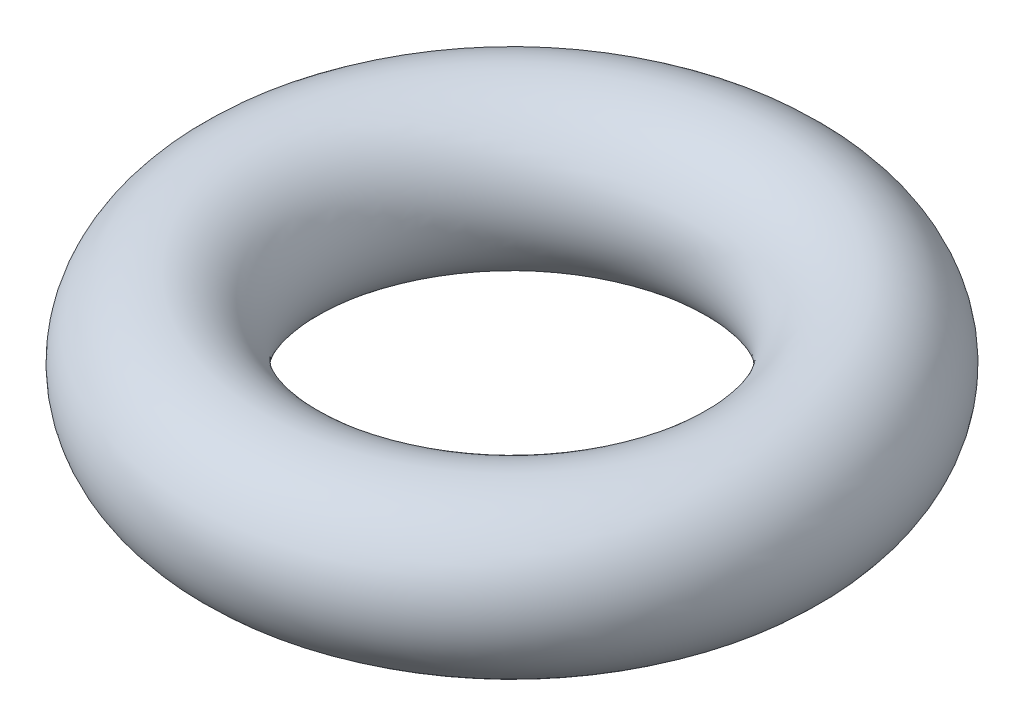
ISO-10303-21;
HEADER;
FILE_DESCRIPTION(('STEP AP214'),'2;1');
FILE_NAME('part.step','',(''),(''),'','','');
FILE_SCHEMA(('AUTOMOTIVE_DESIGN { 1 0 10303 214 1 1 1 1 }'));
ENDSEC;
DATA;
#1=APPLICATION_CONTEXT('core data for automotive mechanical design processes');
#2=APPLICATION_PROTOCOL_DEFINITION('international standard','automotive_design',2000,#1);
#3=PRODUCT_CONTEXT('',#1,'mechanical');
#4=PRODUCT('Part','Part','',(#3));
#5=PRODUCT_RELATED_PRODUCT_CATEGORY('part','',(#4));
#6=PRODUCT_DEFINITION_FORMATION('','',#4);
#7=PRODUCT_DEFINITION_CONTEXT('part definition',#1,'design');
#8=PRODUCT_DEFINITION('design','',#6,#7);
#9=PRODUCT_DEFINITION_SHAPE('','',#8);
#10=(LENGTH_UNIT() NAMED_UNIT(*) SI_UNIT(.MILLI.,.METRE.));
#11=(NAMED_UNIT(*) PLANE_ANGLE_UNIT() SI_UNIT($,.RADIAN.));
#12=(NAMED_UNIT(*) SI_UNIT($,.STERADIAN.) SOLID_ANGLE_UNIT());
#13=UNCERTAINTY_MEASURE_WITH_UNIT(LENGTH_MEASURE(1.E-05),#10,'distance_accuracy_value','');
#14=(GEOMETRIC_REPRESENTATION_CONTEXT(3) GLOBAL_UNCERTAINTY_ASSIGNED_CONTEXT((#13)) GLOBAL_UNIT_ASSIGNED_CONTEXT((#10,
#11,#12)) REPRESENTATION_CONTEXT('',''));
#15=CARTESIAN_POINT('',(0.,0.,0.));
#16=DIRECTION('',(0.,0.,1.));
#17=DIRECTION('',(1.,0.,0.));
#18=AXIS2_PLACEMENT_3D('',#15,#16,#17);
#19=CARTESIAN_POINT('',(0.,0.,0.));
#20=DIRECTION('',(0.,1.,0.));
#21=DIRECTION('',(0.,0.,1.));
#22=AXIS2_PLACEMENT_3D('',#19,#20,#21);
#23=TOROIDAL_SURFACE('',#22,3.,0.95);
#24=CARTESIAN_POINT('',(0.,0.,3.));
#25=DIRECTION('',(1.,0.,0.));
#26=DIRECTION('',(0.,0.,-1.));
#27=AXIS2_PLACEMENT_3D('',#24,#25,#26);
#28=CIRCLE('',#27,0.95);
#29=CARTESIAN_POINT('',(0.,0.,3.95));
#30=VERTEX_POINT('',#29);
#31=EDGE_CURVE('E11',#30,#30,#28,.T.);
#32=CARTESIAN_POINT('',(0.,0.,0.));
#33=DIRECTION('',(0.,1.,0.));
#34=DIRECTION('',(0.,0.,1.));
#35=AXIS2_PLACEMENT_3D('',#32,#33,#34);
#36=CIRCLE('',#35,3.95);
#37=EDGE_CURVE('',#30,#30,#36,.T.);
#38=ORIENTED_EDGE('',*,*,#31,.T.);
#39=ORIENTED_EDGE('',*,*,#31,.F.);
#40=ORIENTED_EDGE('',*,*,#37,.T.);
#41=ORIENTED_EDGE('',*,*,#37,.F.);
#42=EDGE_LOOP('',(#38,#40,#39,#41));
#43=FACE_BOUND('',#42,.T.);
#44=ADVANCED_FACE('F54',(#43),#23,.T.);
#45=CLOSED_SHELL('',(#44));
#46=MANIFOLD_SOLID_BREP('B2',#45);
#47=ADVANCED_BREP_SHAPE_REPRESENTATION('',(#18,#46),#14);
#48=SHAPE_DEFINITION_REPRESENTATION(#9,#47);
ENDSEC;
END-ISO-10303-21;
